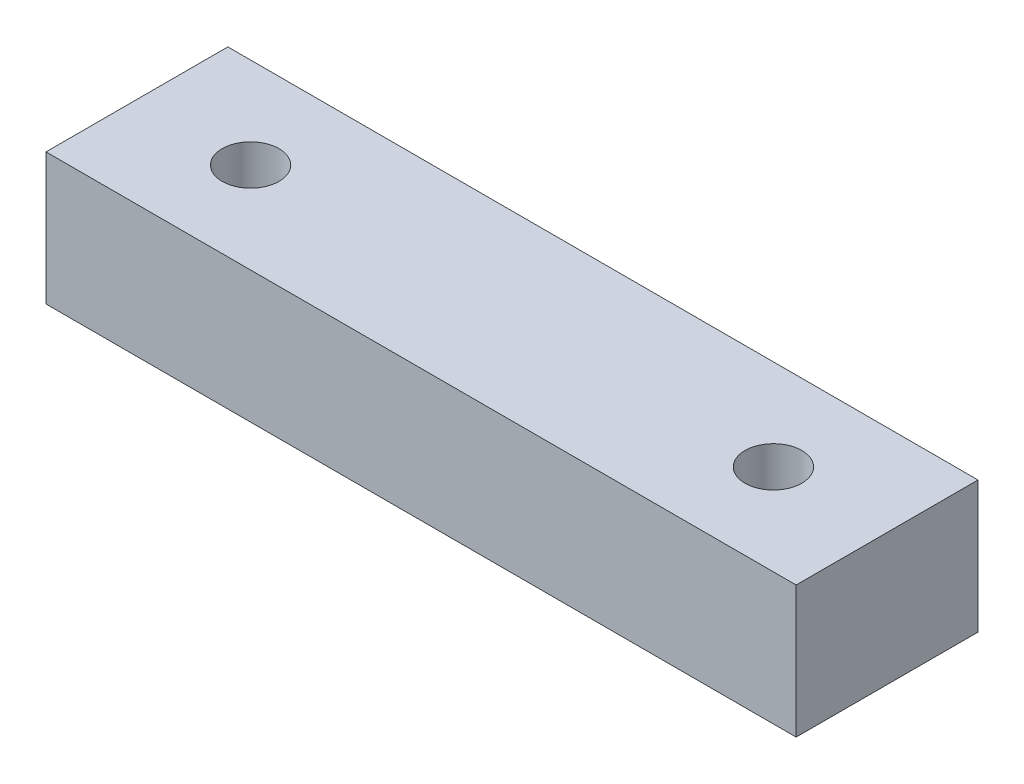
ISO-10303-21;
HEADER;
FILE_DESCRIPTION(('STEP AP214'),'2;1');
FILE_NAME('part.step','',(''),(''),'','','');
FILE_SCHEMA(('AUTOMOTIVE_DESIGN { 1 0 10303 214 1 1 1 1 }'));
ENDSEC;
DATA;
#1=APPLICATION_CONTEXT('core data for automotive mechanical design processes');
#2=APPLICATION_PROTOCOL_DEFINITION('international standard','automotive_design',2000,#1);
#3=PRODUCT_CONTEXT('',#1,'mechanical');
#4=PRODUCT('Part','Part','',(#3));
#5=PRODUCT_RELATED_PRODUCT_CATEGORY('part','',(#4));
#6=PRODUCT_DEFINITION_FORMATION('','',#4);
#7=PRODUCT_DEFINITION_CONTEXT('part definition',#1,'design');
#8=PRODUCT_DEFINITION('design','',#6,#7);
#9=PRODUCT_DEFINITION_SHAPE('','',#8);
#10=(LENGTH_UNIT() NAMED_UNIT(*) SI_UNIT(.MILLI.,.METRE.));
#11=(NAMED_UNIT(*) PLANE_ANGLE_UNIT() SI_UNIT($,.RADIAN.));
#12=(NAMED_UNIT(*) SI_UNIT($,.STERADIAN.) SOLID_ANGLE_UNIT());
#13=UNCERTAINTY_MEASURE_WITH_UNIT(LENGTH_MEASURE(1.E-05),#10,'distance_accuracy_value','');
#14=(GEOMETRIC_REPRESENTATION_CONTEXT(3) GLOBAL_UNCERTAINTY_ASSIGNED_CONTEXT((#13)) GLOBAL_UNIT_ASSIGNED_CONTEXT((#10,
#11,#12)) REPRESENTATION_CONTEXT('',''));
#15=CARTESIAN_POINT('',(0.,0.,0.));
#16=DIRECTION('',(0.,0.,1.));
#17=DIRECTION('',(1.,0.,0.));
#18=AXIS2_PLACEMENT_3D('',#15,#16,#17);
#19=CARTESIAN_POINT('',(0.,14.722475,0.));
#20=DIRECTION('',(0.,-1.,0.));
#21=DIRECTION('',(0.,0.,-1.));
#22=AXIS2_PLACEMENT_3D('',#19,#20,#21);
#23=PLANE('',#22);
#24=DIRECTION('',(0.,0.,-1.));
#25=VECTOR('',#24,1.);
#26=CARTESIAN_POINT('',(41.91,14.722475,10.16));
#27=LINE('',#26,#25);
#28=CARTESIAN_POINT('',(41.91,14.722475,10.16));
#29=VERTEX_POINT('',#28);
#30=CARTESIAN_POINT('',(41.91,14.722475,-10.16));
#31=VERTEX_POINT('',#30);
#32=EDGE_CURVE('E85',#29,#31,#27,.T.);
#33=ORIENTED_EDGE('',*,*,#32,.T.);
#34=DIRECTION('',(-1.,0.,0.));
#35=VECTOR('',#34,1.);
#36=CARTESIAN_POINT('',(-41.91,14.722475,-10.16));
#37=LINE('',#36,#35);
#38=CARTESIAN_POINT('',(-41.91,14.722475,-10.16));
#39=VERTEX_POINT('',#38);
#40=EDGE_CURVE('E80',#31,#39,#37,.T.);
#41=ORIENTED_EDGE('',*,*,#40,.T.);
#42=DIRECTION('',(0.,0.,1.));
#43=VECTOR('',#42,1.);
#44=CARTESIAN_POINT('',(-41.91,14.722475,10.16));
#45=LINE('',#44,#43);
#46=CARTESIAN_POINT('',(-41.91,14.722475,10.16));
#47=VERTEX_POINT('',#46);
#48=EDGE_CURVE('E83',#39,#47,#45,.T.);
#49=ORIENTED_EDGE('',*,*,#48,.T.);
#50=DIRECTION('',(1.,0.,0.));
#51=VECTOR('',#50,1.);
#52=CARTESIAN_POINT('',(-41.91,14.722475,10.16));
#53=LINE('',#52,#51);
#54=EDGE_CURVE('E50',#47,#29,#53,.T.);
#55=ORIENTED_EDGE('',*,*,#54,.T.);
#56=EDGE_LOOP('',(#33,#41,#49,#55));
#57=FACE_BOUND('',#56,.T.);
#58=CARTESIAN_POINT('',(-29.21,14.722475,0.));
#59=DIRECTION('',(0.,1.,0.));
#60=DIRECTION('',(0.,0.,1.));
#61=AXIS2_PLACEMENT_3D('',#58,#59,#60);
#62=CIRCLE('',#61,3.17500000000001);
#63=CARTESIAN_POINT('',(-29.21,14.722475,3.17500000000001));
#64=VERTEX_POINT('',#63);
#65=EDGE_CURVE('E100',#64,#64,#62,.T.);
#66=ORIENTED_EDGE('',*,*,#65,.F.);
#67=EDGE_LOOP('',(#66));
#68=FACE_BOUND('',#67,.T.);
#69=CARTESIAN_POINT('',(29.21,14.722475,0.));
#70=DIRECTION('',(0.,1.,0.));
#71=DIRECTION('',(0.,0.,1.));
#72=AXIS2_PLACEMENT_3D('',#69,#70,#71);
#73=CIRCLE('',#72,3.175);
#74=CARTESIAN_POINT('',(29.21,14.722475,3.175));
#75=VERTEX_POINT('',#74);
#76=EDGE_CURVE('E115',#75,#75,#73,.T.);
#77=ORIENTED_EDGE('',*,*,#76,.F.);
#78=EDGE_LOOP('',(#77));
#79=FACE_BOUND('',#78,.T.);
#80=ADVANCED_FACE('F33',(#57,#68,#79),#23,.F.);
#81=CARTESIAN_POINT('',(0.,0.,0.));
#82=DIRECTION('',(0.,-1.,0.));
#83=DIRECTION('',(0.,0.,-1.));
#84=AXIS2_PLACEMENT_3D('',#81,#82,#83);
#85=PLANE('',#84);
#86=CARTESIAN_POINT('',(-29.21,0.,0.));
#87=DIRECTION('',(0.,1.,0.));
#88=DIRECTION('',(0.,0.,1.));
#89=AXIS2_PLACEMENT_3D('',#86,#87,#88);
#90=CIRCLE('',#89,3.17500000000001);
#91=CARTESIAN_POINT('',(-29.21,0.,3.17500000000001));
#92=VERTEX_POINT('',#91);
#93=EDGE_CURVE('E112',#92,#92,#90,.T.);
#94=ORIENTED_EDGE('',*,*,#93,.T.);
#95=EDGE_LOOP('',(#94));
#96=FACE_BOUND('',#95,.T.);
#97=DIRECTION('',(0.,0.,-1.));
#98=VECTOR('',#97,1.);
#99=CARTESIAN_POINT('',(41.91,0.,10.16));
#100=LINE('',#99,#98);
#101=CARTESIAN_POINT('',(41.91,0.,10.16));
#102=VERTEX_POINT('',#101);
#103=CARTESIAN_POINT('',(41.91,0.,-10.16));
#104=VERTEX_POINT('',#103);
#105=EDGE_CURVE('E97',#102,#104,#100,.T.);
#106=ORIENTED_EDGE('',*,*,#105,.F.);
#107=DIRECTION('',(1.,0.,0.));
#108=VECTOR('',#107,1.);
#109=CARTESIAN_POINT('',(-41.91,0.,10.16));
#110=LINE('',#109,#108);
#111=CARTESIAN_POINT('',(-41.91,0.,10.16));
#112=VERTEX_POINT('',#111);
#113=EDGE_CURVE('E73',#112,#102,#110,.T.);
#114=ORIENTED_EDGE('',*,*,#113,.F.);
#115=DIRECTION('',(0.,0.,1.));
#116=VECTOR('',#115,1.);
#117=CARTESIAN_POINT('',(-41.91,0.,10.16));
#118=LINE('',#117,#116);
#119=CARTESIAN_POINT('',(-41.91,0.,-10.16));
#120=VERTEX_POINT('',#119);
#121=EDGE_CURVE('E67',#120,#112,#118,.T.);
#122=ORIENTED_EDGE('',*,*,#121,.F.);
#123=DIRECTION('',(-1.,0.,0.));
#124=VECTOR('',#123,1.);
#125=CARTESIAN_POINT('',(-41.91,0.,-10.16));
#126=LINE('',#125,#124);
#127=EDGE_CURVE('E89',#104,#120,#126,.T.);
#128=ORIENTED_EDGE('',*,*,#127,.F.);
#129=EDGE_LOOP('',(#106,#114,#122,#128));
#130=FACE_BOUND('',#129,.T.);
#131=CARTESIAN_POINT('',(29.21,0.,0.));
#132=DIRECTION('',(0.,1.,0.));
#133=DIRECTION('',(0.,0.,1.));
#134=AXIS2_PLACEMENT_3D('',#131,#132,#133);
#135=CIRCLE('',#134,3.175);
#136=CARTESIAN_POINT('',(29.21,0.,3.175));
#137=VERTEX_POINT('',#136);
#138=EDGE_CURVE('E118',#137,#137,#135,.T.);
#139=ORIENTED_EDGE('',*,*,#138,.T.);
#140=EDGE_LOOP('',(#139));
#141=FACE_BOUND('',#140,.T.);
#142=ADVANCED_FACE('F108',(#96,#130,#141),#85,.T.);
#143=CARTESIAN_POINT('',(41.91,14.722475,10.16));
#144=DIRECTION('',(-1.,0.,0.));
#145=DIRECTION('',(0.,0.,1.));
#146=AXIS2_PLACEMENT_3D('',#143,#144,#145);
#147=PLANE('',#146);
#148=ORIENTED_EDGE('',*,*,#105,.T.);
#149=DIRECTION('',(0.,-1.,0.));
#150=VECTOR('',#149,1.);
#151=CARTESIAN_POINT('',(41.91,14.722475,-10.16));
#152=LINE('',#151,#150);
#153=EDGE_CURVE('E11',#31,#104,#152,.T.);
#154=ORIENTED_EDGE('',*,*,#153,.F.);
#155=ORIENTED_EDGE('',*,*,#32,.F.);
#156=DIRECTION('',(0.,-1.,0.));
#157=VECTOR('',#156,1.);
#158=CARTESIAN_POINT('',(41.91,14.722475,10.16));
#159=LINE('',#158,#157);
#160=EDGE_CURVE('E93',#29,#102,#159,.T.);
#161=ORIENTED_EDGE('',*,*,#160,.T.);
#162=EDGE_LOOP('',(#148,#154,#155,#161));
#163=FACE_BOUND('',#162,.T.);
#164=ADVANCED_FACE('F35',(#163),#147,.F.);
#165=CARTESIAN_POINT('',(-41.91,14.722475,-10.16));
#166=DIRECTION('',(0.,0.,1.));
#167=DIRECTION('',(1.,0.,0.));
#168=AXIS2_PLACEMENT_3D('',#165,#166,#167);
#169=PLANE('',#168);
#170=ORIENTED_EDGE('',*,*,#127,.T.);
#171=DIRECTION('',(0.,-1.,0.));
#172=VECTOR('',#171,1.);
#173=CARTESIAN_POINT('',(-41.91,14.722475,-10.16));
#174=LINE('',#173,#172);
#175=EDGE_CURVE('E42',#39,#120,#174,.T.);
#176=ORIENTED_EDGE('',*,*,#175,.F.);
#177=ORIENTED_EDGE('',*,*,#40,.F.);
#178=ORIENTED_EDGE('',*,*,#153,.T.);
#179=EDGE_LOOP('',(#170,#176,#177,#178));
#180=FACE_BOUND('',#179,.T.);
#181=ADVANCED_FACE('F88',(#180),#169,.F.);
#182=CARTESIAN_POINT('',(-41.91,14.722475,10.16));
#183=DIRECTION('',(1.,0.,0.));
#184=DIRECTION('',(0.,0.,-1.));
#185=AXIS2_PLACEMENT_3D('',#182,#183,#184);
#186=PLANE('',#185);
#187=ORIENTED_EDGE('',*,*,#121,.T.);
#188=DIRECTION('',(0.,-1.,0.));
#189=VECTOR('',#188,1.);
#190=CARTESIAN_POINT('',(-41.91,14.722475,10.16));
#191=LINE('',#190,#189);
#192=EDGE_CURVE('E90',#47,#112,#191,.T.);
#193=ORIENTED_EDGE('',*,*,#192,.F.);
#194=ORIENTED_EDGE('',*,*,#48,.F.);
#195=ORIENTED_EDGE('',*,*,#175,.T.);
#196=EDGE_LOOP('',(#187,#193,#194,#195));
#197=FACE_BOUND('',#196,.T.);
#198=ADVANCED_FACE('F91',(#197),#186,.F.);
#199=CARTESIAN_POINT('',(-41.91,14.722475,10.16));
#200=DIRECTION('',(0.,0.,-1.));
#201=DIRECTION('',(-1.,0.,0.));
#202=AXIS2_PLACEMENT_3D('',#199,#200,#201);
#203=PLANE('',#202);
#204=ORIENTED_EDGE('',*,*,#113,.T.);
#205=ORIENTED_EDGE('',*,*,#160,.F.);
#206=ORIENTED_EDGE('',*,*,#54,.F.);
#207=ORIENTED_EDGE('',*,*,#192,.T.);
#208=EDGE_LOOP('',(#204,#205,#206,#207));
#209=FACE_BOUND('',#208,.T.);
#210=ADVANCED_FACE('F105',(#209),#203,.F.);
#211=CARTESIAN_POINT('',(-29.21,14.722475,0.));
#212=DIRECTION('',(0.,-1.,0.));
#213=DIRECTION('',(0.,0.,-1.));
#214=AXIS2_PLACEMENT_3D('',#211,#212,#213);
#215=CYLINDRICAL_SURFACE('',#214,3.17500000000001);
#216=ORIENTED_EDGE('',*,*,#65,.T.);
#217=EDGE_LOOP('',(#216));
#218=FACE_BOUND('',#217,.T.);
#219=ORIENTED_EDGE('',*,*,#93,.F.);
#220=EDGE_LOOP('',(#219));
#221=FACE_BOUND('',#220,.T.);
#222=ADVANCED_FACE('F135',(#218,#221),#215,.F.);
#223=CARTESIAN_POINT('',(29.21,14.722475,0.));
#224=DIRECTION('',(0.,-1.,0.));
#225=DIRECTION('',(0.,0.,-1.));
#226=AXIS2_PLACEMENT_3D('',#223,#224,#225);
#227=CYLINDRICAL_SURFACE('',#226,3.175);
#228=ORIENTED_EDGE('',*,*,#76,.T.);
#229=EDGE_LOOP('',(#228));
#230=FACE_BOUND('',#229,.T.);
#231=ORIENTED_EDGE('',*,*,#138,.F.);
#232=EDGE_LOOP('',(#231));
#233=FACE_BOUND('',#232,.T.);
#234=ADVANCED_FACE('F124',(#230,#233),#227,.F.);
#235=CLOSED_SHELL('',(#80,#142,#164,#181,#198,#210,#222,#234));
#236=MANIFOLD_SOLID_BREP('B2',#235);
#237=ADVANCED_BREP_SHAPE_REPRESENTATION('',(#18,#236),#14);
#238=SHAPE_DEFINITION_REPRESENTATION(#9,#237);
ENDSEC;
END-ISO-10303-21;
